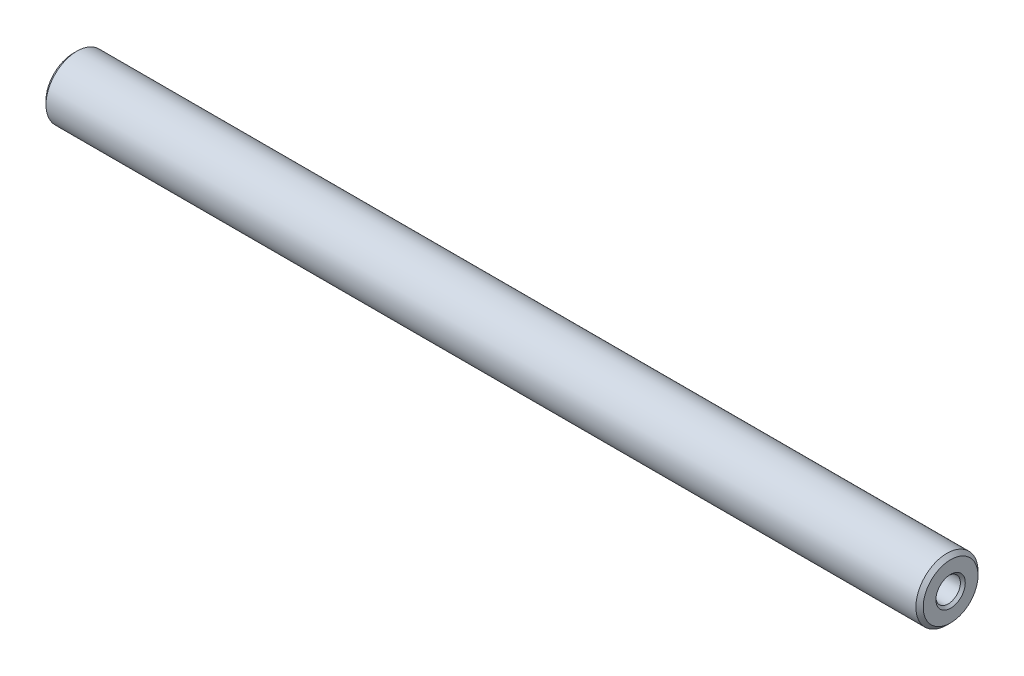
ISO-10303-21;
HEADER;
FILE_DESCRIPTION(('STEP AP214'),'2;1');
FILE_NAME('part.step','',(''),(''),'','','');
FILE_SCHEMA(('AUTOMOTIVE_DESIGN { 1 0 10303 214 1 1 1 1 }'));
ENDSEC;
DATA;
#1=APPLICATION_CONTEXT('core data for automotive mechanical design processes');
#2=APPLICATION_PROTOCOL_DEFINITION('international standard','automotive_design',2000,#1);
#3=PRODUCT_CONTEXT('',#1,'mechanical');
#4=PRODUCT('Part','Part','',(#3));
#5=PRODUCT_RELATED_PRODUCT_CATEGORY('part','',(#4));
#6=PRODUCT_DEFINITION_FORMATION('','',#4);
#7=PRODUCT_DEFINITION_CONTEXT('part definition',#1,'design');
#8=PRODUCT_DEFINITION('design','',#6,#7);
#9=PRODUCT_DEFINITION_SHAPE('','',#8);
#10=(LENGTH_UNIT() NAMED_UNIT(*) SI_UNIT(.MILLI.,.METRE.));
#11=(NAMED_UNIT(*) PLANE_ANGLE_UNIT() SI_UNIT($,.RADIAN.));
#12=(NAMED_UNIT(*) SI_UNIT($,.STERADIAN.) SOLID_ANGLE_UNIT());
#13=UNCERTAINTY_MEASURE_WITH_UNIT(LENGTH_MEASURE(1.E-05),#10,'distance_accuracy_value','');
#14=(GEOMETRIC_REPRESENTATION_CONTEXT(3) GLOBAL_UNCERTAINTY_ASSIGNED_CONTEXT((#13)) GLOBAL_UNIT_ASSIGNED_CONTEXT((#10,
#11,#12)) REPRESENTATION_CONTEXT('',''));
#15=CARTESIAN_POINT('',(0.,0.,0.));
#16=DIRECTION('',(0.,0.,1.));
#17=DIRECTION('',(1.,0.,0.));
#18=AXIS2_PLACEMENT_3D('',#15,#16,#17);
#19=CARTESIAN_POINT('',(179.3,0.,0.));
#20=DIRECTION('',(-1.,0.,0.));
#21=DIRECTION('',(0.,0.,1.));
#22=AXIS2_PLACEMENT_3D('',#19,#20,#21);
#23=CYLINDRICAL_SURFACE('',#22,12.7);
#24=CARTESIAN_POINT('',(-177.8,0.,0.));
#25=DIRECTION('',(1.,0.,0.));
#26=DIRECTION('',(0.,0.,-1.));
#27=AXIS2_PLACEMENT_3D('',#24,#25,#26);
#28=CIRCLE('',#27,12.7);
#29=CARTESIAN_POINT('',(-177.8,0.,-12.7));
#30=VERTEX_POINT('',#29);
#31=EDGE_CURVE('E87',#30,#30,#28,.T.);
#32=ORIENTED_EDGE('',*,*,#31,.T.);
#33=EDGE_LOOP('',(#32));
#34=FACE_BOUND('',#33,.T.);
#35=CARTESIAN_POINT('',(177.8,0.,0.));
#36=DIRECTION('',(1.,0.,0.));
#37=DIRECTION('',(0.,0.,-1.));
#38=AXIS2_PLACEMENT_3D('',#35,#36,#37);
#39=CIRCLE('',#38,12.7);
#40=CARTESIAN_POINT('',(177.8,0.,-12.7));
#41=VERTEX_POINT('',#40);
#42=EDGE_CURVE('E84',#41,#41,#39,.F.);
#43=ORIENTED_EDGE('',*,*,#42,.T.);
#44=EDGE_LOOP('',(#43));
#45=FACE_BOUND('',#44,.T.);
#46=ADVANCED_FACE('F38',(#34,#45),#23,.T.);
#47=CARTESIAN_POINT('',(179.3,0.,0.));
#48=DIRECTION('',(1.,0.,0.));
#49=DIRECTION('',(0.,0.,-1.));
#50=AXIS2_PLACEMENT_3D('',#47,#48,#49);
#51=PLANE('',#50);
#52=CARTESIAN_POINT('',(179.3,0.,0.));
#53=DIRECTION('',(1.,0.,0.));
#54=DIRECTION('',(0.,0.,-1.));
#55=AXIS2_PLACEMENT_3D('',#52,#53,#54);
#56=CIRCLE('',#55,6.);
#57=CARTESIAN_POINT('',(179.3,0.,-6.));
#58=VERTEX_POINT('',#57);
#59=EDGE_CURVE('E62',#58,#58,#56,.T.);
#60=ORIENTED_EDGE('',*,*,#59,.F.);
#61=EDGE_LOOP('',(#60));
#62=FACE_BOUND('',#61,.T.);
#63=CARTESIAN_POINT('',(179.3,0.,0.));
#64=DIRECTION('',(1.,0.,0.));
#65=DIRECTION('',(0.,0.,-1.));
#66=AXIS2_PLACEMENT_3D('',#63,#64,#65);
#67=CIRCLE('',#66,11.2);
#68=CARTESIAN_POINT('',(179.3,0.,-11.2));
#69=VERTEX_POINT('',#68);
#70=EDGE_CURVE('E11',#69,#69,#67,.T.);
#71=ORIENTED_EDGE('',*,*,#70,.T.);
#72=EDGE_LOOP('',(#71));
#73=FACE_BOUND('',#72,.T.);
#74=ADVANCED_FACE('F101',(#62,#73),#51,.T.);
#75=CARTESIAN_POINT('',(-179.3,0.,0.));
#76=DIRECTION('',(1.,0.,0.));
#77=DIRECTION('',(0.,0.,-1.));
#78=AXIS2_PLACEMENT_3D('',#75,#76,#77);
#79=PLANE('',#78);
#80=CARTESIAN_POINT('',(-179.3,0.,0.));
#81=DIRECTION('',(-1.,0.,0.));
#82=DIRECTION('',(0.,0.,1.));
#83=AXIS2_PLACEMENT_3D('',#80,#81,#82);
#84=CIRCLE('',#83,6.);
#85=CARTESIAN_POINT('',(-179.3,0.,6.));
#86=VERTEX_POINT('',#85);
#87=EDGE_CURVE('E158',#86,#86,#84,.T.);
#88=ORIENTED_EDGE('',*,*,#87,.F.);
#89=EDGE_LOOP('',(#88));
#90=FACE_BOUND('',#89,.T.);
#91=CARTESIAN_POINT('',(-179.3,0.,0.));
#92=DIRECTION('',(1.,0.,0.));
#93=DIRECTION('',(0.,0.,-1.));
#94=AXIS2_PLACEMENT_3D('',#91,#92,#93);
#95=CIRCLE('',#94,11.2);
#96=CARTESIAN_POINT('',(-179.3,0.,-11.2));
#97=VERTEX_POINT('',#96);
#98=EDGE_CURVE('E46',#97,#97,#95,.F.);
#99=ORIENTED_EDGE('',*,*,#98,.T.);
#100=EDGE_LOOP('',(#99));
#101=FACE_BOUND('',#100,.T.);
#102=ADVANCED_FACE('F92',(#90,#101),#79,.F.);
#103=CARTESIAN_POINT('',(-177.8,0.,0.));
#104=DIRECTION('',(1.,0.,0.));
#105=DIRECTION('',(0.,0.,-1.));
#106=AXIS2_PLACEMENT_3D('',#103,#104,#105);
#107=CONICAL_SURFACE('',#106,12.7,0.785398163397452);
#108=ORIENTED_EDGE('',*,*,#98,.F.);
#109=EDGE_LOOP('',(#108));
#110=FACE_BOUND('',#109,.T.);
#111=ORIENTED_EDGE('',*,*,#31,.F.);
#112=EDGE_LOOP('',(#111));
#113=FACE_BOUND('',#112,.T.);
#114=ADVANCED_FACE('F94',(#110,#113),#107,.T.);
#115=CARTESIAN_POINT('',(179.3,0.,0.));
#116=DIRECTION('',(-1.,0.,0.));
#117=DIRECTION('',(0.,0.,1.));
#118=AXIS2_PLACEMENT_3D('',#115,#116,#117);
#119=CONICAL_SURFACE('',#118,11.2,0.785398163397433);
#120=ORIENTED_EDGE('',*,*,#42,.F.);
#121=EDGE_LOOP('',(#120));
#122=FACE_BOUND('',#121,.T.);
#123=ORIENTED_EDGE('',*,*,#70,.F.);
#124=EDGE_LOOP('',(#123));
#125=FACE_BOUND('',#124,.T.);
#126=ADVANCED_FACE('F40',(#122,#125),#119,.T.);
#127=CARTESIAN_POINT('',(154.8,0.,0.));
#128=DIRECTION('',(1.,0.,0.));
#129=DIRECTION('',(0.,0.,-1.));
#130=AXIS2_PLACEMENT_3D('',#127,#128,#129);
#131=CONICAL_SURFACE('',#130,4.24999999999999,1.02974425867665);
#132=CARTESIAN_POINT('',(152.246342369133,0.,0.));
#133=VERTEX_POINT('',#132);
#134=VERTEX_LOOP('',#133);
#135=FACE_BOUND('',#134,.T.);
#136=CARTESIAN_POINT('',(154.8,0.,0.));
#137=DIRECTION('',(1.,0.,0.));
#138=DIRECTION('',(0.,0.,-1.));
#139=AXIS2_PLACEMENT_3D('',#136,#137,#138);
#140=CIRCLE('',#139,4.24999999999999);
#141=CARTESIAN_POINT('',(154.8,0.,-4.24999999999999));
#142=VERTEX_POINT('',#141);
#143=EDGE_CURVE('E81',#142,#142,#140,.T.);
#144=ORIENTED_EDGE('',*,*,#143,.T.);
#145=EDGE_LOOP('',(#144));
#146=FACE_BOUND('',#145,.T.);
#147=ADVANCED_FACE('F107',(#135,#146),#131,.F.);
#148=CARTESIAN_POINT('',(179.3,0.,0.));
#149=DIRECTION('',(1.,0.,0.));
#150=DIRECTION('',(0.,0.,-1.));
#151=AXIS2_PLACEMENT_3D('',#148,#149,#150);
#152=CYLINDRICAL_SURFACE('',#151,4.24999999999999);
#153=ORIENTED_EDGE('',*,*,#143,.F.);
#154=EDGE_LOOP('',(#153));
#155=FACE_BOUND('',#154,.T.);
#156=CARTESIAN_POINT('',(159.3,0.,0.));
#157=DIRECTION('',(1.,0.,0.));
#158=DIRECTION('',(0.,0.,-1.));
#159=AXIS2_PLACEMENT_3D('',#156,#157,#158);
#160=CIRCLE('',#159,4.24999999999999);
#161=CARTESIAN_POINT('',(159.3,0.,-4.24999999999999));
#162=VERTEX_POINT('',#161);
#163=EDGE_CURVE('E78',#162,#162,#160,.T.);
#164=ORIENTED_EDGE('',*,*,#163,.T.);
#165=EDGE_LOOP('',(#164));
#166=FACE_BOUND('',#165,.T.);
#167=ADVANCED_FACE('F122',(#155,#166),#152,.F.);
#168=CARTESIAN_POINT('',(159.3,4.24999999999999,0.));
#169=DIRECTION('',(-1.,0.,0.));
#170=DIRECTION('',(0.,0.,1.));
#171=AXIS2_PLACEMENT_3D('',#168,#169,#170);
#172=PLANE('',#171);
#173=ORIENTED_EDGE('',*,*,#163,.F.);
#174=EDGE_LOOP('',(#173));
#175=FACE_BOUND('',#174,.T.);
#176=CARTESIAN_POINT('',(159.3,0.,0.));
#177=DIRECTION('',(1.,0.,0.));
#178=DIRECTION('',(0.,0.,-1.));
#179=AXIS2_PLACEMENT_3D('',#176,#177,#178);
#180=CIRCLE('',#179,5.);
#181=CARTESIAN_POINT('',(159.3,0.,-5.));
#182=VERTEX_POINT('',#181);
#183=EDGE_CURVE('E75',#182,#182,#180,.T.);
#184=ORIENTED_EDGE('',*,*,#183,.T.);
#185=EDGE_LOOP('',(#184));
#186=FACE_BOUND('',#185,.T.);
#187=ADVANCED_FACE('F125',(#175,#186),#172,.F.);
#188=CARTESIAN_POINT('',(179.3,0.,0.));
#189=DIRECTION('',(1.,0.,0.));
#190=DIRECTION('',(0.,0.,-1.));
#191=AXIS2_PLACEMENT_3D('',#188,#189,#190);
#192=CYLINDRICAL_SURFACE('',#191,5.);
#193=ORIENTED_EDGE('',*,*,#183,.F.);
#194=EDGE_LOOP('',(#193));
#195=FACE_BOUND('',#194,.T.);
#196=CARTESIAN_POINT('',(178.3,0.,0.));
#197=DIRECTION('',(1.,0.,0.));
#198=DIRECTION('',(0.,0.,-1.));
#199=AXIS2_PLACEMENT_3D('',#196,#197,#198);
#200=CIRCLE('',#199,5.);
#201=CARTESIAN_POINT('',(178.3,0.,-5.));
#202=VERTEX_POINT('',#201);
#203=EDGE_CURVE('E66',#202,#202,#200,.T.);
#204=ORIENTED_EDGE('',*,*,#203,.T.);
#205=EDGE_LOOP('',(#204));
#206=FACE_BOUND('',#205,.T.);
#207=ADVANCED_FACE('F129',(#195,#206),#192,.F.);
#208=CARTESIAN_POINT('',(179.3,0.,0.));
#209=DIRECTION('',(1.,0.,0.));
#210=DIRECTION('',(0.,0.,-1.));
#211=AXIS2_PLACEMENT_3D('',#208,#209,#210);
#212=CONICAL_SURFACE('',#211,6.,0.78539816339745);
#213=ORIENTED_EDGE('',*,*,#203,.F.);
#214=EDGE_LOOP('',(#213));
#215=FACE_BOUND('',#214,.T.);
#216=ORIENTED_EDGE('',*,*,#59,.T.);
#217=EDGE_LOOP('',(#216));
#218=FACE_BOUND('',#217,.T.);
#219=ADVANCED_FACE('F56',(#215,#218),#212,.F.);
#220=CARTESIAN_POINT('',(-154.8,0.,0.));
#221=DIRECTION('',(-1.,0.,0.));
#222=DIRECTION('',(0.,0.,1.));
#223=AXIS2_PLACEMENT_3D('',#220,#221,#222);
#224=CONICAL_SURFACE('',#223,4.24999999999999,1.02974425867665);
#225=CARTESIAN_POINT('',(-152.246342369133,0.,0.));
#226=VERTEX_POINT('',#225);
#227=VERTEX_LOOP('',#226);
#228=FACE_BOUND('',#227,.T.);
#229=CARTESIAN_POINT('',(-154.8,0.,0.));
#230=DIRECTION('',(-1.,0.,0.));
#231=DIRECTION('',(0.,0.,1.));
#232=AXIS2_PLACEMENT_3D('',#229,#230,#231);
#233=CIRCLE('',#232,4.24999999999999);
#234=CARTESIAN_POINT('',(-154.8,0.,4.24999999999999));
#235=VERTEX_POINT('',#234);
#236=EDGE_CURVE('E60',#235,#235,#233,.T.);
#237=ORIENTED_EDGE('',*,*,#236,.T.);
#238=EDGE_LOOP('',(#237));
#239=FACE_BOUND('',#238,.T.);
#240=ADVANCED_FACE('F52',(#228,#239),#224,.F.);
#241=CARTESIAN_POINT('',(-179.3,0.,0.));
#242=DIRECTION('',(-1.,0.,0.));
#243=DIRECTION('',(0.,0.,1.));
#244=AXIS2_PLACEMENT_3D('',#241,#242,#243);
#245=CYLINDRICAL_SURFACE('',#244,4.24999999999999);
#246=ORIENTED_EDGE('',*,*,#236,.F.);
#247=EDGE_LOOP('',(#246));
#248=FACE_BOUND('',#247,.T.);
#249=CARTESIAN_POINT('',(-159.3,0.,0.));
#250=DIRECTION('',(-1.,0.,0.));
#251=DIRECTION('',(0.,0.,1.));
#252=AXIS2_PLACEMENT_3D('',#249,#250,#251);
#253=CIRCLE('',#252,4.24999999999999);
#254=CARTESIAN_POINT('',(-159.3,0.,4.24999999999999));
#255=VERTEX_POINT('',#254);
#256=EDGE_CURVE('E63',#255,#255,#253,.T.);
#257=ORIENTED_EDGE('',*,*,#256,.T.);
#258=EDGE_LOOP('',(#257));
#259=FACE_BOUND('',#258,.T.);
#260=ADVANCED_FACE('F55',(#248,#259),#245,.F.);
#261=CARTESIAN_POINT('',(-159.3,4.24999999999999,0.));
#262=DIRECTION('',(1.,0.,0.));
#263=DIRECTION('',(0.,0.,-1.));
#264=AXIS2_PLACEMENT_3D('',#261,#262,#263);
#265=PLANE('',#264);
#266=ORIENTED_EDGE('',*,*,#256,.F.);
#267=EDGE_LOOP('',(#266));
#268=FACE_BOUND('',#267,.T.);
#269=CARTESIAN_POINT('',(-159.3,0.,0.));
#270=DIRECTION('',(-1.,0.,0.));
#271=DIRECTION('',(0.,0.,1.));
#272=AXIS2_PLACEMENT_3D('',#269,#270,#271);
#273=CIRCLE('',#272,5.);
#274=CARTESIAN_POINT('',(-159.3,0.,5.));
#275=VERTEX_POINT('',#274);
#276=EDGE_CURVE('E69',#275,#275,#273,.T.);
#277=ORIENTED_EDGE('',*,*,#276,.T.);
#278=EDGE_LOOP('',(#277));
#279=FACE_BOUND('',#278,.T.);
#280=ADVANCED_FACE('F139',(#268,#279),#265,.F.);
#281=CARTESIAN_POINT('',(-179.3,0.,0.));
#282=DIRECTION('',(-1.,0.,0.));
#283=DIRECTION('',(0.,0.,1.));
#284=AXIS2_PLACEMENT_3D('',#281,#282,#283);
#285=CYLINDRICAL_SURFACE('',#284,5.);
#286=ORIENTED_EDGE('',*,*,#276,.F.);
#287=EDGE_LOOP('',(#286));
#288=FACE_BOUND('',#287,.T.);
#289=CARTESIAN_POINT('',(-178.3,0.,0.));
#290=DIRECTION('',(-1.,0.,0.));
#291=DIRECTION('',(0.,0.,1.));
#292=AXIS2_PLACEMENT_3D('',#289,#290,#291);
#293=CIRCLE('',#292,5.);
#294=CARTESIAN_POINT('',(-178.3,0.,5.));
#295=VERTEX_POINT('',#294);
#296=EDGE_CURVE('E155',#295,#295,#293,.T.);
#297=ORIENTED_EDGE('',*,*,#296,.T.);
#298=EDGE_LOOP('',(#297));
#299=FACE_BOUND('',#298,.T.);
#300=ADVANCED_FACE('F142',(#288,#299),#285,.F.);
#301=CARTESIAN_POINT('',(-179.3,0.,0.));
#302=DIRECTION('',(-1.,0.,0.));
#303=DIRECTION('',(0.,0.,1.));
#304=AXIS2_PLACEMENT_3D('',#301,#302,#303);
#305=CONICAL_SURFACE('',#304,6.,0.78539816339745);
#306=ORIENTED_EDGE('',*,*,#296,.F.);
#307=EDGE_LOOP('',(#306));
#308=FACE_BOUND('',#307,.T.);
#309=ORIENTED_EDGE('',*,*,#87,.T.);
#310=EDGE_LOOP('',(#309));
#311=FACE_BOUND('',#310,.T.);
#312=ADVANCED_FACE('F146',(#308,#311),#305,.F.);
#313=CLOSED_SHELL('',(#46,#74,#102,#114,#126,#147,#167,#187,#207,#219,#240,#260,#280,#300,#312));
#314=MANIFOLD_SOLID_BREP('B2',#313);
#315=ADVANCED_BREP_SHAPE_REPRESENTATION('',(#18,#314),#14);
#316=SHAPE_DEFINITION_REPRESENTATION(#9,#315);
ENDSEC;
END-ISO-10303-21;
